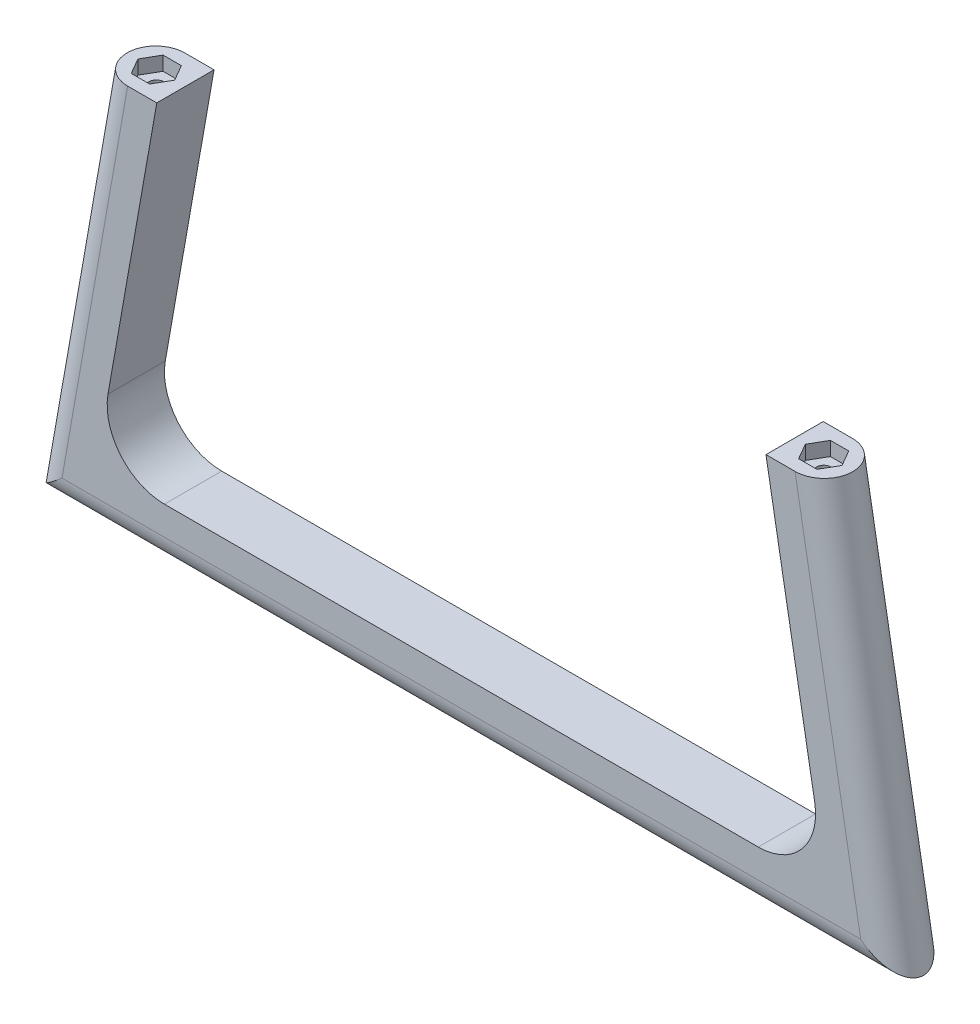
ISO-10303-21;
HEADER;
FILE_DESCRIPTION(('STEP AP214'),'2;1');
FILE_NAME('part.step','',(''),(''),'','','');
FILE_SCHEMA(('AUTOMOTIVE_DESIGN { 1 0 10303 214 1 1 1 1 }'));
ENDSEC;
DATA;
#1=APPLICATION_CONTEXT('core data for automotive mechanical design processes');
#2=APPLICATION_PROTOCOL_DEFINITION('international standard','automotive_design',2000,#1);
#3=PRODUCT_CONTEXT('',#1,'mechanical');
#4=PRODUCT('Part','Part','',(#3));
#5=PRODUCT_RELATED_PRODUCT_CATEGORY('part','',(#4));
#6=PRODUCT_DEFINITION_FORMATION('','',#4);
#7=PRODUCT_DEFINITION_CONTEXT('part definition',#1,'design');
#8=PRODUCT_DEFINITION('design','',#6,#7);
#9=PRODUCT_DEFINITION_SHAPE('','',#8);
#10=(LENGTH_UNIT() NAMED_UNIT(*) SI_UNIT(.MILLI.,.METRE.));
#11=(NAMED_UNIT(*) PLANE_ANGLE_UNIT() SI_UNIT($,.RADIAN.));
#12=(NAMED_UNIT(*) SI_UNIT($,.STERADIAN.) SOLID_ANGLE_UNIT());
#13=UNCERTAINTY_MEASURE_WITH_UNIT(LENGTH_MEASURE(1.E-05),#10,'distance_accuracy_value','');
#14=(GEOMETRIC_REPRESENTATION_CONTEXT(3) GLOBAL_UNCERTAINTY_ASSIGNED_CONTEXT((#13)) GLOBAL_UNIT_ASSIGNED_CONTEXT((#10,
#11,#12)) REPRESENTATION_CONTEXT('',''));
#15=CARTESIAN_POINT('',(0.,0.,0.));
#16=DIRECTION('',(0.,0.,1.));
#17=DIRECTION('',(1.,0.,0.));
#18=AXIS2_PLACEMENT_3D('',#15,#16,#17);
#19=CARTESIAN_POINT('',(0.,0.,-5.));
#20=DIRECTION('',(0.,1.,0.));
#21=DIRECTION('',(-1.,0.,0.));
#22=AXIS2_PLACEMENT_3D('',#19,#20,#21);
#23=PLANE('',#22);
#24=DIRECTION('',(-1.,0.,0.));
#25=VECTOR('',#24,1.);
#26=CARTESIAN_POINT('',(0.,0.,5.));
#27=LINE('',#26,#25);
#28=CARTESIAN_POINT('',(58.25,0.,5.));
#29=VERTEX_POINT('',#28);
#30=CARTESIAN_POINT('',(53.1728669405713,0.,5.));
#31=VERTEX_POINT('',#30);
#32=EDGE_CURVE('E311',#29,#31,#27,.T.);
#33=ORIENTED_EDGE('',*,*,#32,.F.);
#34=CARTESIAN_POINT('',(58.25,0.,0.));
#35=DIRECTION('',(0.,1.,0.));
#36=DIRECTION('',(1.,0.,0.));
#37=AXIS2_PLACEMENT_3D('',#34,#35,#36);
#38=ELLIPSE('',#37,5.07713305942873,5.);
#39=CARTESIAN_POINT('',(58.25,0.,-5.));
#40=VERTEX_POINT('',#39);
#41=EDGE_CURVE('E345',#29,#40,#38,.T.);
#42=ORIENTED_EDGE('',*,*,#41,.T.);
#43=DIRECTION('',(-1.,0.,0.));
#44=VECTOR('',#43,1.);
#45=CARTESIAN_POINT('',(0.,0.,-5.));
#46=LINE('',#45,#44);
#47=CARTESIAN_POINT('',(53.1728669405713,0.,-5.));
#48=VERTEX_POINT('',#47);
#49=EDGE_CURVE('E324',#40,#48,#46,.T.);
#50=ORIENTED_EDGE('',*,*,#49,.T.);
#51=DIRECTION('',(0.,0.,1.));
#52=VECTOR('',#51,1.);
#53=CARTESIAN_POINT('',(53.1728669405713,0.,-5.));
#54=LINE('',#53,#52);
#55=EDGE_CURVE('E328',#48,#31,#54,.T.);
#56=ORIENTED_EDGE('',*,*,#55,.T.);
#57=EDGE_LOOP('',(#33,#42,#50,#56));
#58=FACE_BOUND('',#57,.T.);
#59=DIRECTION('',(0.500000000000001,0.,-0.866025403784438));
#60=VECTOR('',#59,1.);
#61=CARTESIAN_POINT('',(41.2842795044982,0.,23.8354898852218));
#62=LINE('',#61,#60);
#63=CARTESIAN_POINT('',(55.0457060059976,0.,0.));
#64=VERTEX_POINT('',#63);
#65=CARTESIAN_POINT('',(56.6478530029988,0.,-2.77499999999999));
#66=VERTEX_POINT('',#65);
#67=EDGE_CURVE('E227',#64,#66,#62,.T.);
#68=ORIENTED_EDGE('',*,*,#67,.T.);
#69=DIRECTION('',(1.,0.,0.));
#70=VECTOR('',#69,1.);
#71=CARTESIAN_POINT('',(0.,0.,-2.77499999999998));
#72=LINE('',#71,#70);
#73=CARTESIAN_POINT('',(59.8521469970012,0.,-2.77499999999999));
#74=VERTEX_POINT('',#73);
#75=EDGE_CURVE('E61',#66,#74,#72,.T.);
#76=ORIENTED_EDGE('',*,*,#75,.T.);
#77=DIRECTION('',(0.5,0.,0.866025403784438));
#78=VECTOR('',#77,1.);
#79=CARTESIAN_POINT('',(46.0907204955018,0.,-26.6104898852218));
#80=LINE('',#79,#78);
#81=CARTESIAN_POINT('',(61.4542939940024,0.,0.));
#82=VERTEX_POINT('',#81);
#83=EDGE_CURVE('E214',#74,#82,#80,.T.);
#84=ORIENTED_EDGE('',*,*,#83,.T.);
#85=DIRECTION('',(-0.500000000000001,0.,0.866025403784438));
#86=VECTOR('',#85,1.);
#87=CARTESIAN_POINT('',(46.0907204955018,0.,26.6104898852218));
#88=LINE('',#87,#86);
#89=CARTESIAN_POINT('',(59.8521469970012,0.,2.77500000000003));
#90=VERTEX_POINT('',#89);
#91=EDGE_CURVE('E217',#82,#90,#88,.T.);
#92=ORIENTED_EDGE('',*,*,#91,.T.);
#93=DIRECTION('',(-1.,0.,0.));
#94=VECTOR('',#93,1.);
#95=CARTESIAN_POINT('',(0.,0.,2.77500000000003));
#96=LINE('',#95,#94);
#97=CARTESIAN_POINT('',(56.6478530029988,0.,2.77500000000003));
#98=VERTEX_POINT('',#97);
#99=EDGE_CURVE('E233',#90,#98,#96,.T.);
#100=ORIENTED_EDGE('',*,*,#99,.T.);
#101=DIRECTION('',(-0.5,0.,-0.866025403784438));
#102=VECTOR('',#101,1.);
#103=CARTESIAN_POINT('',(41.2842795044981,0.,-23.8354898852218));
#104=LINE('',#103,#102);
#105=EDGE_CURVE('E230',#98,#64,#104,.T.);
#106=ORIENTED_EDGE('',*,*,#105,.T.);
#107=EDGE_LOOP('',(#68,#76,#84,#92,#100,#106));
#108=FACE_BOUND('',#107,.T.);
#109=ADVANCED_FACE('F37',(#58,#108),#23,.T.);
#110=CARTESIAN_POINT('',(0.,0.,-5.));
#111=DIRECTION('',(0.,-1.,0.));
#112=DIRECTION('',(1.,0.,0.));
#113=AXIS2_PLACEMENT_3D('',#110,#111,#112);
#114=PLANE('',#113);
#115=DIRECTION('',(-0.500000000000001,0.,-0.866025403784438));
#116=VECTOR('',#115,1.);
#117=CARTESIAN_POINT('',(-41.2842795044981,0.,23.8354898852218));
#118=LINE('',#117,#116);
#119=CARTESIAN_POINT('',(-55.0457060059976,0.,0.));
#120=VERTEX_POINT('',#119);
#121=CARTESIAN_POINT('',(-56.6478530029988,0.,-2.77500000000002));
#122=VERTEX_POINT('',#121);
#123=EDGE_CURVE('E271',#120,#122,#118,.T.);
#124=ORIENTED_EDGE('',*,*,#123,.F.);
#125=DIRECTION('',(0.5,0.,-0.866025403784438));
#126=VECTOR('',#125,1.);
#127=CARTESIAN_POINT('',(-41.2842795044982,0.,-23.8354898852218));
#128=LINE('',#127,#126);
#129=CARTESIAN_POINT('',(-56.6478530029988,0.,2.77500000000001));
#130=VERTEX_POINT('',#129);
#131=EDGE_CURVE('E53',#130,#120,#128,.T.);
#132=ORIENTED_EDGE('',*,*,#131,.F.);
#133=DIRECTION('',(1.,0.,0.));
#134=VECTOR('',#133,1.);
#135=CARTESIAN_POINT('',(0.,0.,2.775));
#136=LINE('',#135,#134);
#137=CARTESIAN_POINT('',(-59.8521469970012,0.,2.77500000000001));
#138=VERTEX_POINT('',#137);
#139=EDGE_CURVE('E251',#138,#130,#136,.T.);
#140=ORIENTED_EDGE('',*,*,#139,.F.);
#141=DIRECTION('',(0.500000000000001,0.,0.866025403784438));
#142=VECTOR('',#141,1.);
#143=CARTESIAN_POINT('',(-46.0907204955018,0.,26.6104898852218));
#144=LINE('',#143,#142);
#145=CARTESIAN_POINT('',(-61.4542939940024,0.,0.));
#146=VERTEX_POINT('',#145);
#147=EDGE_CURVE('E280',#146,#138,#144,.T.);
#148=ORIENTED_EDGE('',*,*,#147,.F.);
#149=DIRECTION('',(-0.5,0.,0.866025403784438));
#150=VECTOR('',#149,1.);
#151=CARTESIAN_POINT('',(-46.0907204955018,0.,-26.6104898852218));
#152=LINE('',#151,#150);
#153=CARTESIAN_POINT('',(-59.8521469970012,0.,-2.77500000000002));
#154=VERTEX_POINT('',#153);
#155=EDGE_CURVE('E277',#154,#146,#152,.T.);
#156=ORIENTED_EDGE('',*,*,#155,.F.);
#157=DIRECTION('',(-1.,0.,0.));
#158=VECTOR('',#157,1.);
#159=CARTESIAN_POINT('',(0.,0.,-2.77500000000001));
#160=LINE('',#159,#158);
#161=EDGE_CURVE('E274',#122,#154,#160,.T.);
#162=ORIENTED_EDGE('',*,*,#161,.F.);
#163=EDGE_LOOP('',(#124,#132,#140,#148,#156,#162));
#164=FACE_BOUND('',#163,.T.);
#165=DIRECTION('',(1.,0.,0.));
#166=VECTOR('',#165,1.);
#167=CARTESIAN_POINT('',(0.,0.,-5.));
#168=LINE('',#167,#166);
#169=CARTESIAN_POINT('',(-58.25,0.,-5.));
#170=VERTEX_POINT('',#169);
#171=CARTESIAN_POINT('',(-53.1728669405713,0.,-5.));
#172=VERTEX_POINT('',#171);
#173=EDGE_CURVE('E321',#170,#172,#168,.T.);
#174=ORIENTED_EDGE('',*,*,#173,.F.);
#175=CARTESIAN_POINT('',(-58.25,0.,0.));
#176=DIRECTION('',(0.,-1.,0.));
#177=DIRECTION('',(-1.,0.,0.));
#178=AXIS2_PLACEMENT_3D('',#175,#176,#177);
#179=ELLIPSE('',#178,5.07713305942872,5.);
#180=CARTESIAN_POINT('',(-58.25,0.,5.));
#181=VERTEX_POINT('',#180);
#182=EDGE_CURVE('E338',#170,#181,#179,.F.);
#183=ORIENTED_EDGE('',*,*,#182,.T.);
#184=DIRECTION('',(1.,0.,0.));
#185=VECTOR('',#184,1.);
#186=CARTESIAN_POINT('',(0.,0.,5.));
#187=LINE('',#186,#185);
#188=CARTESIAN_POINT('',(-53.1728669405713,0.,5.));
#189=VERTEX_POINT('',#188);
#190=EDGE_CURVE('E308',#181,#189,#187,.T.);
#191=ORIENTED_EDGE('',*,*,#190,.T.);
#192=DIRECTION('',(0.,0.,1.));
#193=VECTOR('',#192,1.);
#194=CARTESIAN_POINT('',(-53.1728669405713,0.,-5.));
#195=LINE('',#194,#193);
#196=EDGE_CURVE('E327',#172,#189,#195,.T.);
#197=ORIENTED_EDGE('',*,*,#196,.F.);
#198=EDGE_LOOP('',(#174,#183,#191,#197));
#199=FACE_BOUND('',#198,.T.);
#200=ADVANCED_FACE('F419',(#164,#199),#114,.F.);
#201=CARTESIAN_POINT('',(-69.7112537460505,-65.,0.));
#202=DIRECTION('',(1.,0.,0.));
#203=DIRECTION('',(0.,0.,-1.));
#204=AXIS2_PLACEMENT_3D('',#201,#202,#203);
#205=CYLINDRICAL_SURFACE('',#204,5.);
#206=DIRECTION('',(1.,0.,0.));
#207=VECTOR('',#206,1.);
#208=CARTESIAN_POINT('',(0.,-65.,5.));
#209=LINE('',#208,#207);
#210=CARTESIAN_POINT('',(-69.7112537460505,-65.0000000000001,5.));
#211=VERTEX_POINT('',#210);
#212=CARTESIAN_POINT('',(69.7112537460505,-65.,5.));
#213=VERTEX_POINT('',#212);
#214=EDGE_CURVE('E347',#211,#213,#209,.T.);
#215=ORIENTED_EDGE('',*,*,#214,.F.);
#216=CARTESIAN_POINT('',(-69.7112537460505,-65.,0.));
#217=DIRECTION('',(0.642787609686538,-0.766044443118979,0.));
#218=DIRECTION('',(-0.766044443118979,-0.642787609686538,0.));
#219=AXIS2_PLACEMENT_3D('',#216,#217,#218);
#220=ELLIPSE('',#219,7.77861913430207,5.);
#221=CARTESIAN_POINT('',(-69.7112537460505,-65.,-5.));
#222=VERTEX_POINT('',#221);
#223=EDGE_CURVE('E353',#222,#211,#220,.F.);
#224=ORIENTED_EDGE('',*,*,#223,.F.);
#225=DIRECTION('',(-1.,0.,0.));
#226=VECTOR('',#225,1.);
#227=CARTESIAN_POINT('',(-69.7112537460505,-65.,-5.));
#228=LINE('',#227,#226);
#229=CARTESIAN_POINT('',(69.7112537460505,-65.0000000000001,-5.));
#230=VERTEX_POINT('',#229);
#231=EDGE_CURVE('E350',#230,#222,#228,.T.);
#232=ORIENTED_EDGE('',*,*,#231,.F.);
#233=CARTESIAN_POINT('',(69.7112537460505,-65.,0.));
#234=DIRECTION('',(-0.642787609686538,-0.766044443118979,0.));
#235=DIRECTION('',(0.766044443118979,-0.642787609686538,0.));
#236=AXIS2_PLACEMENT_3D('',#233,#234,#235);
#237=ELLIPSE('',#236,7.77861913430208,5.);
#238=EDGE_CURVE('E355',#213,#230,#237,.F.);
#239=ORIENTED_EDGE('',*,*,#238,.F.);
#240=EDGE_LOOP('',(#215,#224,#232,#239));
#241=FACE_BOUND('',#240,.T.);
#242=ADVANCED_FACE('F412',(#241),#205,.T.);
#243=CARTESIAN_POINT('',(70.5928886495928,-70.,0.));
#244=DIRECTION('',(0.173648177666934,-0.984807753012208,0.));
#245=DIRECTION('',(0.984807753012207,0.173648177666934,0.));
#246=AXIS2_PLACEMENT_3D('',#243,#244,#245);
#247=CYLINDRICAL_SURFACE('',#246,5.);
#248=DIRECTION('',(-0.173648177666934,0.984807753012208,0.));
#249=VECTOR('',#248,1.);
#250=CARTESIAN_POINT('',(70.5928886495928,-70.,5.));
#251=LINE('',#250,#249);
#252=EDGE_CURVE('E340',#213,#29,#251,.T.);
#253=ORIENTED_EDGE('',*,*,#252,.F.);
#254=ORIENTED_EDGE('',*,*,#238,.T.);
#255=DIRECTION('',(0.173648177666934,-0.984807753012208,0.));
#256=VECTOR('',#255,1.);
#257=CARTESIAN_POINT('',(56.4935475803895,9.96133667436031,-5.));
#258=LINE('',#257,#256);
#259=EDGE_CURVE('E342',#40,#230,#258,.T.);
#260=ORIENTED_EDGE('',*,*,#259,.F.);
#261=ORIENTED_EDGE('',*,*,#41,.F.);
#262=EDGE_LOOP('',(#253,#254,#260,#261));
#263=FACE_BOUND('',#262,.T.);
#264=ADVANCED_FACE('F409',(#263),#247,.T.);
#265=CARTESIAN_POINT('',(-58.25,0.,0.));
#266=DIRECTION('',(-0.173648177666934,-0.984807753012208,0.));
#267=DIRECTION('',(0.984807753012207,-0.173648177666934,0.));
#268=AXIS2_PLACEMENT_3D('',#265,#266,#267);
#269=CYLINDRICAL_SURFACE('',#268,5.);
#270=DIRECTION('',(0.173648177666934,0.984807753012208,0.));
#271=VECTOR('',#270,1.);
#272=CARTESIAN_POINT('',(-58.25,0.,-5.));
#273=LINE('',#272,#271);
#274=EDGE_CURVE('E336',#222,#170,#273,.T.);
#275=ORIENTED_EDGE('',*,*,#274,.F.);
#276=ORIENTED_EDGE('',*,*,#223,.T.);
#277=DIRECTION('',(-0.173648177666934,-0.984807753012208,0.));
#278=VECTOR('',#277,1.);
#279=CARTESIAN_POINT('',(-56.4935475803895,9.96133667436032,5.));
#280=LINE('',#279,#278);
#281=EDGE_CURVE('E331',#181,#211,#280,.T.);
#282=ORIENTED_EDGE('',*,*,#281,.F.);
#283=ORIENTED_EDGE('',*,*,#182,.F.);
#284=EDGE_LOOP('',(#275,#276,#282,#283));
#285=FACE_BOUND('',#284,.T.);
#286=ADVANCED_FACE('F415',(#285),#269,.T.);
#287=CARTESIAN_POINT('',(51.5695088153285,9.09309578602564,-5.));
#288=DIRECTION('',(0.984807753012207,0.173648177666934,0.));
#289=DIRECTION('',(-0.173648177666934,0.984807753012207,0.));
#290=AXIS2_PLACEMENT_3D('',#287,#288,#289);
#291=PLANE('',#290);
#292=DIRECTION('',(-0.173648177666934,0.984807753012208,0.));
#293=VECTOR('',#292,1.);
#294=CARTESIAN_POINT('',(51.5695088153285,9.09309578602564,-5.));
#295=LINE('',#294,#293);
#296=CARTESIAN_POINT('',(61.6830273872593,-48.2635182233307,-5.));
#297=VERTEX_POINT('',#296);
#298=EDGE_CURVE('E314',#297,#48,#295,.T.);
#299=ORIENTED_EDGE('',*,*,#298,.F.);
#300=DIRECTION('',(0.,0.,1.));
#301=VECTOR('',#300,1.);
#302=CARTESIAN_POINT('',(61.6830273872593,-48.2635182233306,-5.));
#303=LINE('',#302,#301);
#304=CARTESIAN_POINT('',(61.6830273872593,-48.2635182233307,5.));
#305=VERTEX_POINT('',#304);
#306=EDGE_CURVE('E357',#297,#305,#303,.T.);
#307=ORIENTED_EDGE('',*,*,#306,.T.);
#308=DIRECTION('',(-0.173648177666934,0.984807753012208,0.));
#309=VECTOR('',#308,1.);
#310=CARTESIAN_POINT('',(51.5695088153285,9.09309578602564,5.));
#311=LINE('',#310,#309);
#312=EDGE_CURVE('E301',#305,#31,#311,.T.);
#313=ORIENTED_EDGE('',*,*,#312,.T.);
#314=ORIENTED_EDGE('',*,*,#55,.F.);
#315=EDGE_LOOP('',(#299,#307,#313,#314));
#316=FACE_BOUND('',#315,.T.);
#317=ADVANCED_FACE('F398',(#316),#291,.F.);
#318=CARTESIAN_POINT('',(-51.5695088153285,9.09309578602564,-5.));
#319=DIRECTION('',(0.984807753012207,-0.173648177666934,0.));
#320=DIRECTION('',(0.173648177666934,0.984807753012207,0.));
#321=AXIS2_PLACEMENT_3D('',#318,#319,#320);
#322=PLANE('',#321);
#323=DIRECTION('',(0.173648177666934,0.984807753012208,0.));
#324=VECTOR('',#323,1.);
#325=CARTESIAN_POINT('',(-51.5695088153285,9.09309578602564,5.));
#326=LINE('',#325,#324);
#327=CARTESIAN_POINT('',(-61.6830273872593,-48.2635182233307,5.));
#328=VERTEX_POINT('',#327);
#329=EDGE_CURVE('E306',#328,#189,#326,.T.);
#330=ORIENTED_EDGE('',*,*,#329,.F.);
#331=DIRECTION('',(0.,0.,1.));
#332=VECTOR('',#331,1.);
#333=CARTESIAN_POINT('',(-61.6830273872593,-48.2635182233306,-5.));
#334=LINE('',#333,#332);
#335=CARTESIAN_POINT('',(-61.6830273872593,-48.2635182233307,-5.));
#336=VERTEX_POINT('',#335);
#337=EDGE_CURVE('E365',#328,#336,#334,.F.);
#338=ORIENTED_EDGE('',*,*,#337,.T.);
#339=DIRECTION('',(0.173648177666934,0.984807753012208,0.));
#340=VECTOR('',#339,1.);
#341=CARTESIAN_POINT('',(-51.5695088153285,9.09309578602564,-5.));
#342=LINE('',#341,#340);
#343=EDGE_CURVE('E319',#336,#172,#342,.T.);
#344=ORIENTED_EDGE('',*,*,#343,.T.);
#345=ORIENTED_EDGE('',*,*,#196,.T.);
#346=EDGE_LOOP('',(#330,#338,#344,#345));
#347=FACE_BOUND('',#346,.T.);
#348=ADVANCED_FACE('F380',(#347),#322,.T.);
#349=CARTESIAN_POINT('',(0.,-60.,-5.));
#350=DIRECTION('',(0.,1.,0.));
#351=DIRECTION('',(0.,0.,1.));
#352=AXIS2_PLACEMENT_3D('',#349,#350,#351);
#353=PLANE('',#352);
#354=DIRECTION('',(-1.,0.,0.));
#355=VECTOR('',#354,1.);
#356=CARTESIAN_POINT('',(0.,-60.,5.));
#357=LINE('',#356,#355);
#358=CARTESIAN_POINT('',(51.8349498571373,-60.,5.));
#359=VERTEX_POINT('',#358);
#360=CARTESIAN_POINT('',(-51.8349498571372,-60.,5.));
#361=VERTEX_POINT('',#360);
#362=EDGE_CURVE('E303',#359,#361,#357,.T.);
#363=ORIENTED_EDGE('',*,*,#362,.F.);
#364=DIRECTION('',(0.,0.,1.));
#365=VECTOR('',#364,1.);
#366=CARTESIAN_POINT('',(51.8349498571373,-60.,-5.));
#367=LINE('',#366,#365);
#368=CARTESIAN_POINT('',(51.8349498571373,-60.,-5.));
#369=VERTEX_POINT('',#368);
#370=EDGE_CURVE('E363',#359,#369,#367,.F.);
#371=ORIENTED_EDGE('',*,*,#370,.T.);
#372=DIRECTION('',(-1.,0.,0.));
#373=VECTOR('',#372,1.);
#374=CARTESIAN_POINT('',(0.,-60.,-5.));
#375=LINE('',#374,#373);
#376=CARTESIAN_POINT('',(-51.8349498571372,-60.,-5.));
#377=VERTEX_POINT('',#376);
#378=EDGE_CURVE('E316',#369,#377,#375,.T.);
#379=ORIENTED_EDGE('',*,*,#378,.T.);
#380=DIRECTION('',(0.,0.,1.));
#381=VECTOR('',#380,1.);
#382=CARTESIAN_POINT('',(-51.8349498571372,-60.,5.));
#383=LINE('',#382,#381);
#384=EDGE_CURVE('E360',#377,#361,#383,.T.);
#385=ORIENTED_EDGE('',*,*,#384,.T.);
#386=EDGE_LOOP('',(#363,#371,#379,#385));
#387=FACE_BOUND('',#386,.T.);
#388=ADVANCED_FACE('F389',(#387),#353,.T.);
#389=CARTESIAN_POINT('',(0.,0.,-5.));
#390=DIRECTION('',(0.,0.,1.));
#391=DIRECTION('',(1.,0.,0.));
#392=AXIS2_PLACEMENT_3D('',#389,#390,#391);
#393=PLANE('',#392);
#394=ORIENTED_EDGE('',*,*,#259,.T.);
#395=ORIENTED_EDGE('',*,*,#231,.T.);
#396=ORIENTED_EDGE('',*,*,#274,.T.);
#397=ORIENTED_EDGE('',*,*,#173,.T.);
#398=ORIENTED_EDGE('',*,*,#343,.F.);
#399=CARTESIAN_POINT('',(-51.8349498571372,-50.,-5.));
#400=DIRECTION('',(0.,0.,1.));
#401=DIRECTION('',(1.,0.,0.));
#402=AXIS2_PLACEMENT_3D('',#399,#400,#401);
#403=CIRCLE('',#402,10.);
#404=EDGE_CURVE('E11',#336,#377,#403,.T.);
#405=ORIENTED_EDGE('',*,*,#404,.T.);
#406=ORIENTED_EDGE('',*,*,#378,.F.);
#407=CARTESIAN_POINT('',(51.8349498571373,-50.,-5.));
#408=DIRECTION('',(0.,0.,1.));
#409=DIRECTION('',(1.,0.,0.));
#410=AXIS2_PLACEMENT_3D('',#407,#408,#409);
#411=CIRCLE('',#410,10.);
#412=EDGE_CURVE('E369',#369,#297,#411,.T.);
#413=ORIENTED_EDGE('',*,*,#412,.T.);
#414=ORIENTED_EDGE('',*,*,#298,.T.);
#415=ORIENTED_EDGE('',*,*,#49,.F.);
#416=EDGE_LOOP('',(#394,#395,#396,#397,#398,#405,#406,#413,#414,#415));
#417=FACE_BOUND('',#416,.T.);
#418=ADVANCED_FACE('F386',(#417),#393,.F.);
#419=CARTESIAN_POINT('',(0.,0.,5.));
#420=DIRECTION('',(0.,0.,1.));
#421=DIRECTION('',(1.,0.,0.));
#422=AXIS2_PLACEMENT_3D('',#419,#420,#421);
#423=PLANE('',#422);
#424=ORIENTED_EDGE('',*,*,#281,.T.);
#425=ORIENTED_EDGE('',*,*,#214,.T.);
#426=ORIENTED_EDGE('',*,*,#252,.T.);
#427=ORIENTED_EDGE('',*,*,#32,.T.);
#428=ORIENTED_EDGE('',*,*,#312,.F.);
#429=CARTESIAN_POINT('',(51.8349498571373,-50.,5.));
#430=DIRECTION('',(0.,0.,1.));
#431=DIRECTION('',(1.,0.,0.));
#432=AXIS2_PLACEMENT_3D('',#429,#430,#431);
#433=CIRCLE('',#432,10.);
#434=EDGE_CURVE('E367',#305,#359,#433,.F.);
#435=ORIENTED_EDGE('',*,*,#434,.T.);
#436=ORIENTED_EDGE('',*,*,#362,.T.);
#437=CARTESIAN_POINT('',(-51.8349498571372,-50.,5.));
#438=DIRECTION('',(0.,0.,1.));
#439=DIRECTION('',(1.,0.,0.));
#440=AXIS2_PLACEMENT_3D('',#437,#438,#439);
#441=CIRCLE('',#440,10.);
#442=EDGE_CURVE('E46',#361,#328,#441,.F.);
#443=ORIENTED_EDGE('',*,*,#442,.T.);
#444=ORIENTED_EDGE('',*,*,#329,.T.);
#445=ORIENTED_EDGE('',*,*,#190,.F.);
#446=EDGE_LOOP('',(#424,#425,#426,#427,#428,#435,#436,#443,#444,#445));
#447=FACE_BOUND('',#446,.T.);
#448=ADVANCED_FACE('F373',(#447),#423,.T.);
#449=CARTESIAN_POINT('',(51.8349498571373,-50.,-5.));
#450=DIRECTION('',(0.,0.,1.));
#451=DIRECTION('',(1.,0.,0.));
#452=AXIS2_PLACEMENT_3D('',#449,#450,#451);
#453=CYLINDRICAL_SURFACE('',#452,10.);
#454=ORIENTED_EDGE('',*,*,#412,.F.);
#455=ORIENTED_EDGE('',*,*,#370,.F.);
#456=ORIENTED_EDGE('',*,*,#434,.F.);
#457=ORIENTED_EDGE('',*,*,#306,.F.);
#458=EDGE_LOOP('',(#454,#455,#456,#457));
#459=FACE_BOUND('',#458,.T.);
#460=ADVANCED_FACE('F392',(#459),#453,.F.);
#461=CARTESIAN_POINT('',(-51.8349498571372,-50.,-5.));
#462=DIRECTION('',(0.,0.,-1.));
#463=DIRECTION('',(-1.,0.,0.));
#464=AXIS2_PLACEMENT_3D('',#461,#462,#463);
#465=CYLINDRICAL_SURFACE('',#464,10.);
#466=ORIENTED_EDGE('',*,*,#404,.F.);
#467=ORIENTED_EDGE('',*,*,#337,.F.);
#468=ORIENTED_EDGE('',*,*,#442,.F.);
#469=ORIENTED_EDGE('',*,*,#384,.F.);
#470=EDGE_LOOP('',(#466,#467,#468,#469));
#471=FACE_BOUND('',#470,.T.);
#472=ADVANCED_FACE('F39',(#471),#465,.F.);
#473=CARTESIAN_POINT('',(-41.2842795044982,-2.45000000000001,-23.8354898852218));
#474=DIRECTION('',(0.866025403784438,0.,0.500000000000001));
#475=DIRECTION('',(0.500000000000001,0.,-0.866025403784438));
#476=AXIS2_PLACEMENT_3D('',#473,#474,#475);
#477=PLANE('',#476);
#478=ORIENTED_EDGE('',*,*,#131,.T.);
#479=DIRECTION('',(0.,1.,0.));
#480=VECTOR('',#479,1.);
#481=CARTESIAN_POINT('',(-55.0457060059976,-2.45000000000001,0.));
#482=LINE('',#481,#480);
#483=CARTESIAN_POINT('',(-55.0457060059976,-2.45000000000001,0.));
#484=VERTEX_POINT('',#483);
#485=EDGE_CURVE('E269',#484,#120,#482,.T.);
#486=ORIENTED_EDGE('',*,*,#485,.F.);
#487=DIRECTION('',(0.5,0.,-0.866025403784438));
#488=VECTOR('',#487,1.);
#489=CARTESIAN_POINT('',(-41.2842795044982,-2.45000000000001,-23.8354898852218));
#490=LINE('',#489,#488);
#491=CARTESIAN_POINT('',(-56.6478530029988,-2.45000000000001,2.77500000000001));
#492=VERTEX_POINT('',#491);
#493=EDGE_CURVE('E250',#492,#484,#490,.T.);
#494=ORIENTED_EDGE('',*,*,#493,.F.);
#495=DIRECTION('',(0.,1.,0.));
#496=VECTOR('',#495,1.);
#497=CARTESIAN_POINT('',(-56.6478530029988,-2.45000000000001,2.77500000000001));
#498=LINE('',#497,#496);
#499=EDGE_CURVE('E228',#492,#130,#498,.T.);
#500=ORIENTED_EDGE('',*,*,#499,.T.);
#501=EDGE_LOOP('',(#478,#486,#494,#500));
#502=FACE_BOUND('',#501,.T.);
#503=ADVANCED_FACE('F456',(#502),#477,.F.);
#504=CARTESIAN_POINT('',(0.,-2.45,2.775));
#505=DIRECTION('',(0.,0.,1.));
#506=DIRECTION('',(1.,0.,0.));
#507=AXIS2_PLACEMENT_3D('',#504,#505,#506);
#508=PLANE('',#507);
#509=ORIENTED_EDGE('',*,*,#139,.T.);
#510=ORIENTED_EDGE('',*,*,#499,.F.);
#511=DIRECTION('',(1.,0.,0.));
#512=VECTOR('',#511,1.);
#513=CARTESIAN_POINT('',(0.,-2.45,2.775));
#514=LINE('',#513,#512);
#515=CARTESIAN_POINT('',(-59.8521469970012,-2.45000000000001,2.77500000000001));
#516=VERTEX_POINT('',#515);
#517=EDGE_CURVE('E266',#516,#492,#514,.T.);
#518=ORIENTED_EDGE('',*,*,#517,.F.);
#519=DIRECTION('',(0.,1.,0.));
#520=VECTOR('',#519,1.);
#521=CARTESIAN_POINT('',(-59.8521469970012,-2.45000000000001,2.77500000000001));
#522=LINE('',#521,#520);
#523=EDGE_CURVE('E286',#516,#138,#522,.T.);
#524=ORIENTED_EDGE('',*,*,#523,.T.);
#525=EDGE_LOOP('',(#509,#510,#518,#524));
#526=FACE_BOUND('',#525,.T.);
#527=ADVANCED_FACE('F480',(#526),#508,.F.);
#528=CARTESIAN_POINT('',(-46.0907204955018,-2.45000000000001,26.6104898852218));
#529=DIRECTION('',(-0.866025403784438,0.,0.500000000000001));
#530=DIRECTION('',(0.500000000000001,0.,0.866025403784438));
#531=AXIS2_PLACEMENT_3D('',#528,#529,#530);
#532=PLANE('',#531);
#533=ORIENTED_EDGE('',*,*,#147,.T.);
#534=ORIENTED_EDGE('',*,*,#523,.F.);
#535=DIRECTION('',(0.500000000000001,0.,0.866025403784438));
#536=VECTOR('',#535,1.);
#537=CARTESIAN_POINT('',(-46.0907204955018,-2.45000000000001,26.6104898852218));
#538=LINE('',#537,#536);
#539=CARTESIAN_POINT('',(-61.4542939940024,-2.45000000000001,0.));
#540=VERTEX_POINT('',#539);
#541=EDGE_CURVE('E263',#540,#516,#538,.T.);
#542=ORIENTED_EDGE('',*,*,#541,.F.);
#543=DIRECTION('',(0.,1.,0.));
#544=VECTOR('',#543,1.);
#545=CARTESIAN_POINT('',(-61.4542939940024,-2.45000000000001,0.));
#546=LINE('',#545,#544);
#547=EDGE_CURVE('E288',#540,#146,#546,.T.);
#548=ORIENTED_EDGE('',*,*,#547,.T.);
#549=EDGE_LOOP('',(#533,#534,#542,#548));
#550=FACE_BOUND('',#549,.T.);
#551=ADVANCED_FACE('F493',(#550),#532,.F.);
#552=CARTESIAN_POINT('',(-46.0907204955018,-2.45000000000001,-26.6104898852218));
#553=DIRECTION('',(-0.866025403784438,0.,-0.5));
#554=DIRECTION('',(-0.5,0.,0.866025403784438));
#555=AXIS2_PLACEMENT_3D('',#552,#553,#554);
#556=PLANE('',#555);
#557=ORIENTED_EDGE('',*,*,#155,.T.);
#558=ORIENTED_EDGE('',*,*,#547,.F.);
#559=DIRECTION('',(-0.5,0.,0.866025403784438));
#560=VECTOR('',#559,1.);
#561=CARTESIAN_POINT('',(-46.0907204955018,-2.45000000000001,-26.6104898852218));
#562=LINE('',#561,#560);
#563=CARTESIAN_POINT('',(-59.8521469970012,-2.45000000000001,-2.77500000000002));
#564=VERTEX_POINT('',#563);
#565=EDGE_CURVE('E260',#564,#540,#562,.T.);
#566=ORIENTED_EDGE('',*,*,#565,.F.);
#567=DIRECTION('',(0.,1.,0.));
#568=VECTOR('',#567,1.);
#569=CARTESIAN_POINT('',(-59.8521469970012,-2.45000000000001,-2.77500000000002));
#570=LINE('',#569,#568);
#571=EDGE_CURVE('E290',#564,#154,#570,.T.);
#572=ORIENTED_EDGE('',*,*,#571,.T.);
#573=EDGE_LOOP('',(#557,#558,#566,#572));
#574=FACE_BOUND('',#573,.T.);
#575=ADVANCED_FACE('F489',(#574),#556,.F.);
#576=CARTESIAN_POINT('',(0.,-2.45,-2.77500000000001));
#577=DIRECTION('',(0.,0.,-1.));
#578=DIRECTION('',(-1.,0.,0.));
#579=AXIS2_PLACEMENT_3D('',#576,#577,#578);
#580=PLANE('',#579);
#581=ORIENTED_EDGE('',*,*,#161,.T.);
#582=ORIENTED_EDGE('',*,*,#571,.F.);
#583=DIRECTION('',(-1.,0.,0.));
#584=VECTOR('',#583,1.);
#585=CARTESIAN_POINT('',(0.,-2.45,-2.77500000000001));
#586=LINE('',#585,#584);
#587=CARTESIAN_POINT('',(-56.6478530029988,-2.45000000000001,-2.77500000000002));
#588=VERTEX_POINT('',#587);
#589=EDGE_CURVE('E257',#588,#564,#586,.T.);
#590=ORIENTED_EDGE('',*,*,#589,.F.);
#591=DIRECTION('',(0.,1.,0.));
#592=VECTOR('',#591,1.);
#593=CARTESIAN_POINT('',(-56.6478530029988,-2.45000000000001,-2.77500000000002));
#594=LINE('',#593,#592);
#595=EDGE_CURVE('E292',#588,#122,#594,.T.);
#596=ORIENTED_EDGE('',*,*,#595,.T.);
#597=EDGE_LOOP('',(#581,#582,#590,#596));
#598=FACE_BOUND('',#597,.T.);
#599=ADVANCED_FACE('F485',(#598),#580,.F.);
#600=CARTESIAN_POINT('',(-41.2842795044981,-2.45000000000001,23.8354898852218));
#601=DIRECTION('',(0.866025403784438,0.,-0.500000000000001));
#602=DIRECTION('',(-0.500000000000001,0.,-0.866025403784438));
#603=AXIS2_PLACEMENT_3D('',#600,#601,#602);
#604=PLANE('',#603);
#605=ORIENTED_EDGE('',*,*,#123,.T.);
#606=ORIENTED_EDGE('',*,*,#595,.F.);
#607=DIRECTION('',(-0.500000000000001,0.,-0.866025403784438));
#608=VECTOR('',#607,1.);
#609=CARTESIAN_POINT('',(-41.2842795044981,-2.45000000000001,23.8354898852218));
#610=LINE('',#609,#608);
#611=EDGE_CURVE('E254',#484,#588,#610,.T.);
#612=ORIENTED_EDGE('',*,*,#611,.F.);
#613=ORIENTED_EDGE('',*,*,#485,.T.);
#614=EDGE_LOOP('',(#605,#606,#612,#613));
#615=FACE_BOUND('',#614,.T.);
#616=ADVANCED_FACE('F481',(#615),#604,.F.);
#617=CARTESIAN_POINT('',(0.,-2.45,0.));
#618=DIRECTION('',(0.,1.,0.));
#619=DIRECTION('',(-1.,0.,0.));
#620=AXIS2_PLACEMENT_3D('',#617,#618,#619);
#621=PLANE('',#620);
#622=CARTESIAN_POINT('',(-58.25,-2.45000000000001,0.));
#623=DIRECTION('',(0.,1.,0.));
#624=DIRECTION('',(-1.,0.,0.));
#625=AXIS2_PLACEMENT_3D('',#622,#623,#624);
#626=CIRCLE('',#625,1.24999999999999);
#627=CARTESIAN_POINT('',(-59.5,-2.45000000000001,0.));
#628=VERTEX_POINT('',#627);
#629=EDGE_CURVE('E247',#628,#628,#626,.F.);
#630=ORIENTED_EDGE('',*,*,#629,.T.);
#631=EDGE_LOOP('',(#630));
#632=FACE_BOUND('',#631,.T.);
#633=ORIENTED_EDGE('',*,*,#493,.T.);
#634=ORIENTED_EDGE('',*,*,#611,.T.);
#635=ORIENTED_EDGE('',*,*,#589,.T.);
#636=ORIENTED_EDGE('',*,*,#565,.T.);
#637=ORIENTED_EDGE('',*,*,#541,.T.);
#638=ORIENTED_EDGE('',*,*,#517,.T.);
#639=EDGE_LOOP('',(#633,#634,#635,#636,#637,#638));
#640=FACE_BOUND('',#639,.T.);
#641=ADVANCED_FACE('F484',(#632,#640),#621,.T.);
#642=CARTESIAN_POINT('',(0.,-2.45,0.));
#643=DIRECTION('',(0.,1.,0.));
#644=DIRECTION('',(-1.,0.,0.));
#645=AXIS2_PLACEMENT_3D('',#642,#643,#644);
#646=PLANE('',#645);
#647=DIRECTION('',(1.,0.,0.));
#648=VECTOR('',#647,1.);
#649=CARTESIAN_POINT('',(0.,-2.45,-2.77499999999998));
#650=LINE('',#649,#648);
#651=CARTESIAN_POINT('',(56.6478530029988,-2.44999999999999,-2.77499999999999));
#652=VERTEX_POINT('',#651);
#653=CARTESIAN_POINT('',(59.8521469970012,-2.44999999999999,-2.77499999999999));
#654=VERTEX_POINT('',#653);
#655=EDGE_CURVE('E204',#652,#654,#650,.T.);
#656=ORIENTED_EDGE('',*,*,#655,.F.);
#657=DIRECTION('',(0.500000000000001,0.,-0.866025403784438));
#658=VECTOR('',#657,1.);
#659=CARTESIAN_POINT('',(41.2842795044982,-2.44999999999999,23.8354898852218));
#660=LINE('',#659,#658);
#661=CARTESIAN_POINT('',(55.0457060059976,-2.44999999999999,0.));
#662=VERTEX_POINT('',#661);
#663=EDGE_CURVE('E194',#662,#652,#660,.T.);
#664=ORIENTED_EDGE('',*,*,#663,.F.);
#665=DIRECTION('',(-0.5,0.,-0.866025403784438));
#666=VECTOR('',#665,1.);
#667=CARTESIAN_POINT('',(41.2842795044981,-2.44999999999999,-23.8354898852218));
#668=LINE('',#667,#666);
#669=CARTESIAN_POINT('',(56.6478530029988,-2.44999999999999,2.77500000000003));
#670=VERTEX_POINT('',#669);
#671=EDGE_CURVE('E203',#670,#662,#668,.T.);
#672=ORIENTED_EDGE('',*,*,#671,.F.);
#673=DIRECTION('',(-1.,0.,0.));
#674=VECTOR('',#673,1.);
#675=CARTESIAN_POINT('',(0.,-2.45,2.77500000000003));
#676=LINE('',#675,#674);
#677=CARTESIAN_POINT('',(59.8521469970012,-2.44999999999999,2.77500000000003));
#678=VERTEX_POINT('',#677);
#679=EDGE_CURVE('E221',#678,#670,#676,.T.);
#680=ORIENTED_EDGE('',*,*,#679,.F.);
#681=DIRECTION('',(-0.500000000000001,0.,0.866025403784438));
#682=VECTOR('',#681,1.);
#683=CARTESIAN_POINT('',(46.0907204955018,-2.44999999999999,26.6104898852218));
#684=LINE('',#683,#682);
#685=CARTESIAN_POINT('',(61.4542939940024,-2.44999999999999,0.));
#686=VERTEX_POINT('',#685);
#687=EDGE_CURVE('E223',#686,#678,#684,.T.);
#688=ORIENTED_EDGE('',*,*,#687,.F.);
#689=DIRECTION('',(0.5,0.,0.866025403784438));
#690=VECTOR('',#689,1.);
#691=CARTESIAN_POINT('',(46.0907204955018,-2.44999999999999,-26.6104898852218));
#692=LINE('',#691,#690);
#693=EDGE_CURVE('E209',#654,#686,#692,.T.);
#694=ORIENTED_EDGE('',*,*,#693,.F.);
#695=EDGE_LOOP('',(#656,#664,#672,#680,#688,#694));
#696=FACE_BOUND('',#695,.T.);
#697=CARTESIAN_POINT('',(58.25,-2.44999999999999,0.));
#698=DIRECTION('',(0.,1.,0.));
#699=DIRECTION('',(-1.,0.,0.));
#700=AXIS2_PLACEMENT_3D('',#697,#698,#699);
#701=CIRCLE('',#700,1.24999999999999);
#702=CARTESIAN_POINT('',(57.,-2.44999999999999,0.));
#703=VERTEX_POINT('',#702);
#704=EDGE_CURVE('E41',#703,#703,#701,.F.);
#705=ORIENTED_EDGE('',*,*,#704,.T.);
#706=EDGE_LOOP('',(#705));
#707=FACE_BOUND('',#706,.T.);
#708=ADVANCED_FACE('F211',(#696,#707),#646,.T.);
#709=CARTESIAN_POINT('',(0.,-2.45,-2.77499999999998));
#710=DIRECTION('',(0.,0.,1.));
#711=DIRECTION('',(1.,0.,0.));
#712=AXIS2_PLACEMENT_3D('',#709,#710,#711);
#713=PLANE('',#712);
#714=ORIENTED_EDGE('',*,*,#75,.F.);
#715=DIRECTION('',(0.,1.,0.));
#716=VECTOR('',#715,1.);
#717=CARTESIAN_POINT('',(56.6478530029988,-2.44999999999999,-2.77499999999999));
#718=LINE('',#717,#716);
#719=EDGE_CURVE('E197',#652,#66,#718,.T.);
#720=ORIENTED_EDGE('',*,*,#719,.F.);
#721=ORIENTED_EDGE('',*,*,#655,.T.);
#722=DIRECTION('',(0.,1.,0.));
#723=VECTOR('',#722,1.);
#724=CARTESIAN_POINT('',(59.8521469970012,-2.44999999999999,-2.77499999999999));
#725=LINE('',#724,#723);
#726=EDGE_CURVE('E238',#654,#74,#725,.T.);
#727=ORIENTED_EDGE('',*,*,#726,.T.);
#728=EDGE_LOOP('',(#714,#720,#721,#727));
#729=FACE_BOUND('',#728,.T.);
#730=ADVANCED_FACE('F207',(#729),#713,.T.);
#731=CARTESIAN_POINT('',(46.0907204955018,-2.44999999999999,-26.6104898852218));
#732=DIRECTION('',(-0.866025403784438,0.,0.5));
#733=DIRECTION('',(0.5,0.,0.866025403784438));
#734=AXIS2_PLACEMENT_3D('',#731,#732,#733);
#735=PLANE('',#734);
#736=ORIENTED_EDGE('',*,*,#83,.F.);
#737=ORIENTED_EDGE('',*,*,#726,.F.);
#738=ORIENTED_EDGE('',*,*,#693,.T.);
#739=DIRECTION('',(0.,1.,0.));
#740=VECTOR('',#739,1.);
#741=CARTESIAN_POINT('',(61.4542939940024,-2.44999999999999,0.));
#742=LINE('',#741,#740);
#743=EDGE_CURVE('E240',#686,#82,#742,.T.);
#744=ORIENTED_EDGE('',*,*,#743,.T.);
#745=EDGE_LOOP('',(#736,#737,#738,#744));
#746=FACE_BOUND('',#745,.T.);
#747=ADVANCED_FACE('F506',(#746),#735,.T.);
#748=CARTESIAN_POINT('',(46.0907204955018,-2.44999999999999,26.6104898852218));
#749=DIRECTION('',(-0.866025403784438,0.,-0.500000000000001));
#750=DIRECTION('',(-0.500000000000001,0.,0.866025403784438));
#751=AXIS2_PLACEMENT_3D('',#748,#749,#750);
#752=PLANE('',#751);
#753=ORIENTED_EDGE('',*,*,#91,.F.);
#754=ORIENTED_EDGE('',*,*,#743,.F.);
#755=ORIENTED_EDGE('',*,*,#687,.T.);
#756=DIRECTION('',(0.,1.,0.));
#757=VECTOR('',#756,1.);
#758=CARTESIAN_POINT('',(59.8521469970012,-2.44999999999999,2.77500000000003));
#759=LINE('',#758,#757);
#760=EDGE_CURVE('E242',#678,#90,#759,.T.);
#761=ORIENTED_EDGE('',*,*,#760,.T.);
#762=EDGE_LOOP('',(#753,#754,#755,#761));
#763=FACE_BOUND('',#762,.T.);
#764=ADVANCED_FACE('F516',(#763),#752,.T.);
#765=CARTESIAN_POINT('',(0.,-2.45,2.77500000000003));
#766=DIRECTION('',(0.,0.,-1.));
#767=DIRECTION('',(-1.,0.,0.));
#768=AXIS2_PLACEMENT_3D('',#765,#766,#767);
#769=PLANE('',#768);
#770=ORIENTED_EDGE('',*,*,#99,.F.);
#771=ORIENTED_EDGE('',*,*,#760,.F.);
#772=ORIENTED_EDGE('',*,*,#679,.T.);
#773=DIRECTION('',(0.,1.,0.));
#774=VECTOR('',#773,1.);
#775=CARTESIAN_POINT('',(56.6478530029988,-2.44999999999999,2.77500000000003));
#776=LINE('',#775,#774);
#777=EDGE_CURVE('E244',#670,#98,#776,.T.);
#778=ORIENTED_EDGE('',*,*,#777,.T.);
#779=EDGE_LOOP('',(#770,#771,#772,#778));
#780=FACE_BOUND('',#779,.T.);
#781=ADVANCED_FACE('F512',(#780),#769,.T.);
#782=CARTESIAN_POINT('',(41.2842795044981,-2.44999999999999,-23.8354898852218));
#783=DIRECTION('',(0.866025403784438,0.,-0.500000000000001));
#784=DIRECTION('',(-0.500000000000001,0.,-0.866025403784438));
#785=AXIS2_PLACEMENT_3D('',#782,#783,#784);
#786=PLANE('',#785);
#787=ORIENTED_EDGE('',*,*,#105,.F.);
#788=ORIENTED_EDGE('',*,*,#777,.F.);
#789=ORIENTED_EDGE('',*,*,#671,.T.);
#790=DIRECTION('',(0.,1.,0.));
#791=VECTOR('',#790,1.);
#792=CARTESIAN_POINT('',(55.0457060059976,-2.44999999999999,0.));
#793=LINE('',#792,#791);
#794=EDGE_CURVE('E199',#662,#64,#793,.T.);
#795=ORIENTED_EDGE('',*,*,#794,.T.);
#796=EDGE_LOOP('',(#787,#788,#789,#795));
#797=FACE_BOUND('',#796,.T.);
#798=ADVANCED_FACE('F509',(#797),#786,.T.);
#799=CARTESIAN_POINT('',(41.2842795044982,-2.44999999999999,23.8354898852218));
#800=DIRECTION('',(0.866025403784438,0.,0.500000000000001));
#801=DIRECTION('',(0.500000000000001,0.,-0.866025403784438));
#802=AXIS2_PLACEMENT_3D('',#799,#800,#801);
#803=PLANE('',#802);
#804=ORIENTED_EDGE('',*,*,#67,.F.);
#805=ORIENTED_EDGE('',*,*,#794,.F.);
#806=ORIENTED_EDGE('',*,*,#663,.T.);
#807=ORIENTED_EDGE('',*,*,#719,.T.);
#808=EDGE_LOOP('',(#804,#805,#806,#807));
#809=FACE_BOUND('',#808,.T.);
#810=ADVANCED_FACE('F196',(#809),#803,.T.);
#811=CARTESIAN_POINT('',(-58.25,-9.50000000000001,0.));
#812=DIRECTION('',(0.,1.,0.));
#813=DIRECTION('',(0.,0.,1.));
#814=AXIS2_PLACEMENT_3D('',#811,#812,#813);
#815=CONICAL_SURFACE('',#814,1.24999999999999,1.02974425867665);
#816=CARTESIAN_POINT('',(-58.25,-10.2510757737845,0.));
#817=VERTEX_POINT('',#816);
#818=VERTEX_LOOP('',#817);
#819=FACE_BOUND('',#818,.T.);
#820=CARTESIAN_POINT('',(-58.25,-9.50000000000001,0.));
#821=DIRECTION('',(0.,1.,0.));
#822=DIRECTION('',(0.,0.,1.));
#823=AXIS2_PLACEMENT_3D('',#820,#821,#822);
#824=CIRCLE('',#823,1.24999999999999);
#825=CARTESIAN_POINT('',(-58.25,-9.50000000000001,1.24999999999999));
#826=VERTEX_POINT('',#825);
#827=EDGE_CURVE('E295',#826,#826,#824,.T.);
#828=ORIENTED_EDGE('',*,*,#827,.T.);
#829=EDGE_LOOP('',(#828));
#830=FACE_BOUND('',#829,.T.);
#831=ADVANCED_FACE('F471',(#819,#830),#815,.F.);
#832=CARTESIAN_POINT('',(-58.25,0.,0.));
#833=DIRECTION('',(0.,1.,0.));
#834=DIRECTION('',(0.,0.,1.));
#835=AXIS2_PLACEMENT_3D('',#832,#833,#834);
#836=CYLINDRICAL_SURFACE('',#835,1.24999999999999);
#837=ORIENTED_EDGE('',*,*,#827,.F.);
#838=EDGE_LOOP('',(#837));
#839=FACE_BOUND('',#838,.T.);
#840=ORIENTED_EDGE('',*,*,#629,.F.);
#841=EDGE_LOOP('',(#840));
#842=FACE_BOUND('',#841,.T.);
#843=ADVANCED_FACE('F466',(#839,#842),#836,.F.);
#844=CARTESIAN_POINT('',(58.25,-9.49999999999999,0.));
#845=DIRECTION('',(0.,1.,0.));
#846=DIRECTION('',(0.,0.,1.));
#847=AXIS2_PLACEMENT_3D('',#844,#845,#846);
#848=CONICAL_SURFACE('',#847,1.24999999999999,1.02974425867665);
#849=CARTESIAN_POINT('',(58.25,-10.2510757737844,0.));
#850=VERTEX_POINT('',#849);
#851=VERTEX_LOOP('',#850);
#852=FACE_BOUND('',#851,.T.);
#853=CARTESIAN_POINT('',(58.25,-9.49999999999999,0.));
#854=DIRECTION('',(0.,1.,0.));
#855=DIRECTION('',(0.,0.,1.));
#856=AXIS2_PLACEMENT_3D('',#853,#854,#855);
#857=CIRCLE('',#856,1.24999999999999);
#858=CARTESIAN_POINT('',(58.25,-9.49999999999999,1.24999999999999));
#859=VERTEX_POINT('',#858);
#860=EDGE_CURVE('E298',#859,#859,#857,.T.);
#861=ORIENTED_EDGE('',*,*,#860,.T.);
#862=EDGE_LOOP('',(#861));
#863=FACE_BOUND('',#862,.T.);
#864=ADVANCED_FACE('F462',(#852,#863),#848,.F.);
#865=CARTESIAN_POINT('',(58.25,0.,0.));
#866=DIRECTION('',(0.,1.,0.));
#867=DIRECTION('',(0.,0.,1.));
#868=AXIS2_PLACEMENT_3D('',#865,#866,#867);
#869=CYLINDRICAL_SURFACE('',#868,1.24999999999999);
#870=ORIENTED_EDGE('',*,*,#860,.F.);
#871=EDGE_LOOP('',(#870));
#872=FACE_BOUND('',#871,.T.);
#873=ORIENTED_EDGE('',*,*,#704,.F.);
#874=EDGE_LOOP('',(#873));
#875=FACE_BOUND('',#874,.T.);
#876=ADVANCED_FACE('F465',(#872,#875),#869,.F.);
#877=CLOSED_SHELL('',(#109,#200,#242,#264,#286,#317,#348,#388,#418,#448,#460,#472,#503,#527,
#551,#575,#599,#616,#641,#708,#730,#747,#764,#781,#798,#810,#831,#843,#864,#876));
#878=MANIFOLD_SOLID_BREP('B2',#877);
#879=ADVANCED_BREP_SHAPE_REPRESENTATION('',(#18,#878),#14);
#880=SHAPE_DEFINITION_REPRESENTATION(#9,#879);
ENDSEC;
END-ISO-10303-21;
